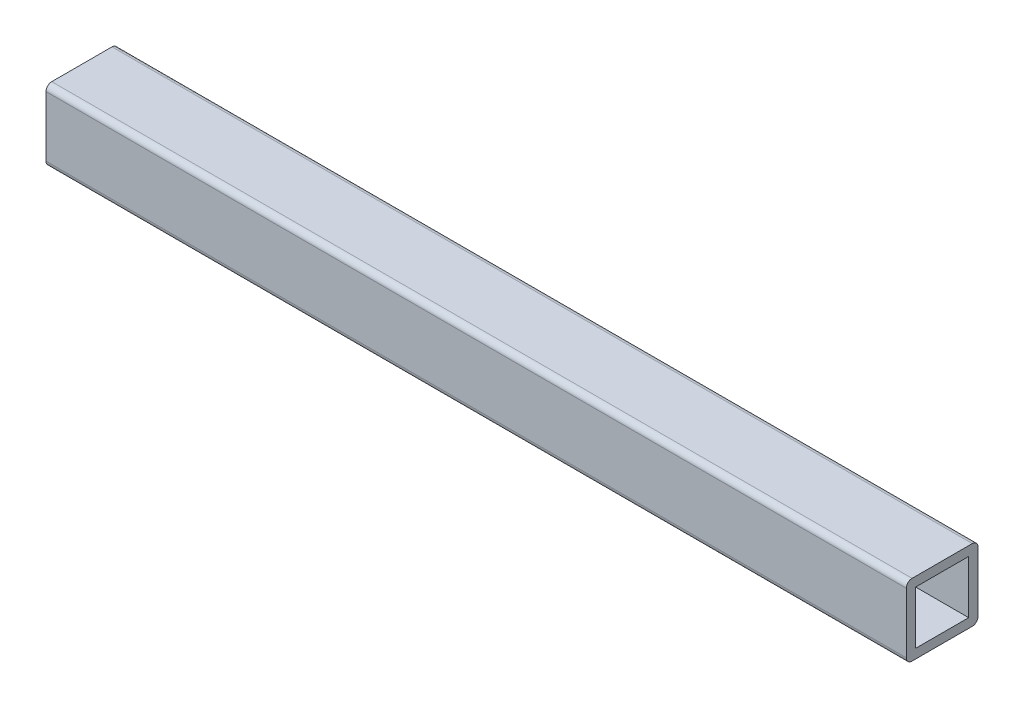
ISO-10303-21;
HEADER;
FILE_DESCRIPTION(('STEP AP214'),'2;1');
FILE_NAME('part.step','',(''),(''),'','','');
FILE_SCHEMA(('AUTOMOTIVE_DESIGN { 1 0 10303 214 1 1 1 1 }'));
ENDSEC;
DATA;
#1=APPLICATION_CONTEXT('core data for automotive mechanical design processes');
#2=APPLICATION_PROTOCOL_DEFINITION('international standard','automotive_design',2000,#1);
#3=PRODUCT_CONTEXT('',#1,'mechanical');
#4=PRODUCT('Part','Part','',(#3));
#5=PRODUCT_RELATED_PRODUCT_CATEGORY('part','',(#4));
#6=PRODUCT_DEFINITION_FORMATION('','',#4);
#7=PRODUCT_DEFINITION_CONTEXT('part definition',#1,'design');
#8=PRODUCT_DEFINITION('design','',#6,#7);
#9=PRODUCT_DEFINITION_SHAPE('','',#8);
#10=(LENGTH_UNIT() NAMED_UNIT(*) SI_UNIT(.MILLI.,.METRE.));
#11=(NAMED_UNIT(*) PLANE_ANGLE_UNIT() SI_UNIT($,.RADIAN.));
#12=(NAMED_UNIT(*) SI_UNIT($,.STERADIAN.) SOLID_ANGLE_UNIT());
#13=UNCERTAINTY_MEASURE_WITH_UNIT(LENGTH_MEASURE(1.E-05),#10,'distance_accuracy_value','');
#14=(GEOMETRIC_REPRESENTATION_CONTEXT(3) GLOBAL_UNCERTAINTY_ASSIGNED_CONTEXT((#13)) GLOBAL_UNIT_ASSIGNED_CONTEXT((#10,
#11,#12)) REPRESENTATION_CONTEXT('',''));
#15=CARTESIAN_POINT('',(0.,0.,0.));
#16=DIRECTION('',(0.,0.,1.));
#17=DIRECTION('',(1.,0.,0.));
#18=AXIS2_PLACEMENT_3D('',#15,#16,#17);
#19=CARTESIAN_POINT('',(152.4,10.541,21.209));
#20=DIRECTION('',(1.,0.,0.));
#21=DIRECTION('',(0.,0.,-1.));
#22=AXIS2_PLACEMENT_3D('',#19,#20,#21);
#23=PLANE('',#22);
#24=CARTESIAN_POINT('',(152.4,10.541,21.209));
#25=DIRECTION('',(1.,0.,0.));
#26=DIRECTION('',(0.,0.,-1.));
#27=AXIS2_PLACEMENT_3D('',#24,#25,#26);
#28=CIRCLE('',#27,1.01599999999999);
#29=CARTESIAN_POINT('',(152.4,10.541,22.225));
#30=VERTEX_POINT('',#29);
#31=CARTESIAN_POINT('',(152.4,9.525,21.209));
#32=VERTEX_POINT('',#31);
#33=EDGE_CURVE('E204',#30,#32,#28,.T.);
#34=ORIENTED_EDGE('',*,*,#33,.T.);
#35=DIRECTION('',(0.,0.,-1.));
#36=VECTOR('',#35,1.);
#37=CARTESIAN_POINT('',(152.4,9.525,21.209));
#38=LINE('',#37,#36);
#39=CARTESIAN_POINT('',(152.4,9.525,10.541));
#40=VERTEX_POINT('',#39);
#41=EDGE_CURVE('E248',#32,#40,#38,.T.);
#42=ORIENTED_EDGE('',*,*,#41,.T.);
#43=CARTESIAN_POINT('',(152.4,10.541,10.541));
#44=DIRECTION('',(1.,0.,0.));
#45=DIRECTION('',(0.,0.,-1.));
#46=AXIS2_PLACEMENT_3D('',#43,#44,#45);
#47=CIRCLE('',#46,1.016);
#48=CARTESIAN_POINT('',(152.4,10.541,9.525));
#49=VERTEX_POINT('',#48);
#50=EDGE_CURVE('E139',#40,#49,#47,.T.);
#51=ORIENTED_EDGE('',*,*,#50,.T.);
#52=DIRECTION('',(0.,1.,0.));
#53=VECTOR('',#52,1.);
#54=CARTESIAN_POINT('',(152.4,10.541,9.525));
#55=LINE('',#54,#53);
#56=CARTESIAN_POINT('',(152.4,21.209,9.525));
#57=VERTEX_POINT('',#56);
#58=EDGE_CURVE('E244',#49,#57,#55,.T.);
#59=ORIENTED_EDGE('',*,*,#58,.T.);
#60=CARTESIAN_POINT('',(152.4,21.209,10.541));
#61=DIRECTION('',(1.,0.,0.));
#62=DIRECTION('',(0.,0.,-1.));
#63=AXIS2_PLACEMENT_3D('',#60,#61,#62);
#64=CIRCLE('',#63,1.016);
#65=CARTESIAN_POINT('',(152.4,22.225,10.541));
#66=VERTEX_POINT('',#65);
#67=EDGE_CURVE('E241',#57,#66,#64,.T.);
#68=ORIENTED_EDGE('',*,*,#67,.T.);
#69=DIRECTION('',(0.,0.,1.));
#70=VECTOR('',#69,1.);
#71=CARTESIAN_POINT('',(152.4,22.225,10.541));
#72=LINE('',#71,#70);
#73=CARTESIAN_POINT('',(152.4,22.225,21.209));
#74=VERTEX_POINT('',#73);
#75=EDGE_CURVE('E220',#66,#74,#72,.T.);
#76=ORIENTED_EDGE('',*,*,#75,.T.);
#77=CARTESIAN_POINT('',(152.4,21.209,21.209));
#78=DIRECTION('',(1.,0.,0.));
#79=DIRECTION('',(0.,0.,-1.));
#80=AXIS2_PLACEMENT_3D('',#77,#78,#79);
#81=CIRCLE('',#80,1.016);
#82=CARTESIAN_POINT('',(152.4,21.209,22.225));
#83=VERTEX_POINT('',#82);
#84=EDGE_CURVE('E237',#74,#83,#81,.T.);
#85=ORIENTED_EDGE('',*,*,#84,.T.);
#86=DIRECTION('',(0.,-1.,0.));
#87=VECTOR('',#86,1.);
#88=CARTESIAN_POINT('',(152.4,21.209,22.225));
#89=LINE('',#88,#87);
#90=EDGE_CURVE('E201',#83,#30,#89,.T.);
#91=ORIENTED_EDGE('',*,*,#90,.T.);
#92=EDGE_LOOP('',(#34,#42,#51,#59,#68,#76,#85,#91));
#93=FACE_BOUND('',#92,.T.);
#94=DIRECTION('',(0.,1.,0.));
#95=VECTOR('',#94,1.);
#96=CARTESIAN_POINT('',(152.4,11.176,11.176));
#97=LINE('',#96,#95);
#98=CARTESIAN_POINT('',(152.4,11.176,11.176));
#99=VERTEX_POINT('',#98);
#100=CARTESIAN_POINT('',(152.4,20.574,11.176));
#101=VERTEX_POINT('',#100);
#102=EDGE_CURVE('E185',#99,#101,#97,.T.);
#103=ORIENTED_EDGE('',*,*,#102,.F.);
#104=DIRECTION('',(0.,0.,-1.));
#105=VECTOR('',#104,1.);
#106=CARTESIAN_POINT('',(152.4,11.176,20.574));
#107=LINE('',#106,#105);
#108=CARTESIAN_POINT('',(152.4,11.176,20.574));
#109=VERTEX_POINT('',#108);
#110=EDGE_CURVE('E90',#109,#99,#107,.T.);
#111=ORIENTED_EDGE('',*,*,#110,.F.);
#112=DIRECTION('',(0.,-1.,0.));
#113=VECTOR('',#112,1.);
#114=CARTESIAN_POINT('',(152.4,20.574,20.574));
#115=LINE('',#114,#113);
#116=CARTESIAN_POINT('',(152.4,20.574,20.574));
#117=VERTEX_POINT('',#116);
#118=EDGE_CURVE('E178',#117,#109,#115,.T.);
#119=ORIENTED_EDGE('',*,*,#118,.F.);
#120=DIRECTION('',(0.,0.,1.));
#121=VECTOR('',#120,1.);
#122=CARTESIAN_POINT('',(152.4,20.574,11.176));
#123=LINE('',#122,#121);
#124=EDGE_CURVE('E192',#101,#117,#123,.T.);
#125=ORIENTED_EDGE('',*,*,#124,.F.);
#126=EDGE_LOOP('',(#103,#111,#119,#125));
#127=FACE_BOUND('',#126,.T.);
#128=ADVANCED_FACE('F43',(#93,#127),#23,.T.);
#129=CARTESIAN_POINT('',(0.,10.541,21.209));
#130=DIRECTION('',(1.,0.,0.));
#131=DIRECTION('',(0.,0.,-1.));
#132=AXIS2_PLACEMENT_3D('',#129,#130,#131);
#133=PLANE('',#132);
#134=CARTESIAN_POINT('',(0.,10.541,21.209));
#135=DIRECTION('',(1.,0.,0.));
#136=DIRECTION('',(0.,0.,-1.));
#137=AXIS2_PLACEMENT_3D('',#134,#135,#136);
#138=CIRCLE('',#137,1.01599999999999);
#139=CARTESIAN_POINT('',(0.,10.541,22.225));
#140=VERTEX_POINT('',#139);
#141=CARTESIAN_POINT('',(0.,9.525,21.209));
#142=VERTEX_POINT('',#141);
#143=EDGE_CURVE('E132',#140,#142,#138,.T.);
#144=ORIENTED_EDGE('',*,*,#143,.F.);
#145=DIRECTION('',(0.,-1.,0.));
#146=VECTOR('',#145,1.);
#147=CARTESIAN_POINT('',(0.,21.209,22.225));
#148=LINE('',#147,#146);
#149=CARTESIAN_POINT('',(0.,21.209,22.225));
#150=VERTEX_POINT('',#149);
#151=EDGE_CURVE('E202',#150,#140,#148,.T.);
#152=ORIENTED_EDGE('',*,*,#151,.F.);
#153=CARTESIAN_POINT('',(0.,21.209,21.209));
#154=DIRECTION('',(1.,0.,0.));
#155=DIRECTION('',(0.,0.,-1.));
#156=AXIS2_PLACEMENT_3D('',#153,#154,#155);
#157=CIRCLE('',#156,1.016);
#158=CARTESIAN_POINT('',(0.,22.225,21.209));
#159=VERTEX_POINT('',#158);
#160=EDGE_CURVE('E205',#159,#150,#157,.T.);
#161=ORIENTED_EDGE('',*,*,#160,.F.);
#162=DIRECTION('',(0.,0.,1.));
#163=VECTOR('',#162,1.);
#164=CARTESIAN_POINT('',(0.,22.225,10.541));
#165=LINE('',#164,#163);
#166=CARTESIAN_POINT('',(0.,22.225,10.541));
#167=VERTEX_POINT('',#166);
#168=EDGE_CURVE('E207',#167,#159,#165,.T.);
#169=ORIENTED_EDGE('',*,*,#168,.F.);
#170=CARTESIAN_POINT('',(0.,21.209,10.541));
#171=DIRECTION('',(1.,0.,0.));
#172=DIRECTION('',(0.,0.,-1.));
#173=AXIS2_PLACEMENT_3D('',#170,#171,#172);
#174=CIRCLE('',#173,1.016);
#175=CARTESIAN_POINT('',(0.,21.209,9.525));
#176=VERTEX_POINT('',#175);
#177=EDGE_CURVE('E148',#176,#167,#174,.T.);
#178=ORIENTED_EDGE('',*,*,#177,.F.);
#179=DIRECTION('',(0.,1.,0.));
#180=VECTOR('',#179,1.);
#181=CARTESIAN_POINT('',(0.,10.541,9.525));
#182=LINE('',#181,#180);
#183=CARTESIAN_POINT('',(0.,10.541,9.525));
#184=VERTEX_POINT('',#183);
#185=EDGE_CURVE('E146',#184,#176,#182,.T.);
#186=ORIENTED_EDGE('',*,*,#185,.F.);
#187=CARTESIAN_POINT('',(0.,10.541,10.541));
#188=DIRECTION('',(1.,0.,0.));
#189=DIRECTION('',(0.,0.,-1.));
#190=AXIS2_PLACEMENT_3D('',#187,#188,#189);
#191=CIRCLE('',#190,1.016);
#192=CARTESIAN_POINT('',(0.,9.525,10.541));
#193=VERTEX_POINT('',#192);
#194=EDGE_CURVE('E131',#193,#184,#191,.T.);
#195=ORIENTED_EDGE('',*,*,#194,.F.);
#196=DIRECTION('',(0.,0.,-1.));
#197=VECTOR('',#196,1.);
#198=CARTESIAN_POINT('',(0.,9.525,21.209));
#199=LINE('',#198,#197);
#200=EDGE_CURVE('E121',#142,#193,#199,.T.);
#201=ORIENTED_EDGE('',*,*,#200,.F.);
#202=EDGE_LOOP('',(#144,#152,#161,#169,#178,#186,#195,#201));
#203=FACE_BOUND('',#202,.T.);
#204=DIRECTION('',(0.,0.,-1.));
#205=VECTOR('',#204,1.);
#206=CARTESIAN_POINT('',(0.,11.176,20.574));
#207=LINE('',#206,#205);
#208=CARTESIAN_POINT('',(0.,11.176,20.574));
#209=VERTEX_POINT('',#208);
#210=CARTESIAN_POINT('',(0.,11.176,11.176));
#211=VERTEX_POINT('',#210);
#212=EDGE_CURVE('E68',#209,#211,#207,.T.);
#213=ORIENTED_EDGE('',*,*,#212,.T.);
#214=DIRECTION('',(0.,1.,0.));
#215=VECTOR('',#214,1.);
#216=CARTESIAN_POINT('',(0.,11.176,11.176));
#217=LINE('',#216,#215);
#218=CARTESIAN_POINT('',(0.,20.574,11.176));
#219=VERTEX_POINT('',#218);
#220=EDGE_CURVE('E153',#211,#219,#217,.T.);
#221=ORIENTED_EDGE('',*,*,#220,.T.);
#222=DIRECTION('',(0.,0.,1.));
#223=VECTOR('',#222,1.);
#224=CARTESIAN_POINT('',(0.,20.574,11.176));
#225=LINE('',#224,#223);
#226=CARTESIAN_POINT('',(0.,20.574,20.574));
#227=VERTEX_POINT('',#226);
#228=EDGE_CURVE('E156',#219,#227,#225,.T.);
#229=ORIENTED_EDGE('',*,*,#228,.T.);
#230=DIRECTION('',(0.,-1.,0.));
#231=VECTOR('',#230,1.);
#232=CARTESIAN_POINT('',(0.,20.574,20.574));
#233=LINE('',#232,#231);
#234=EDGE_CURVE('E159',#227,#209,#233,.T.);
#235=ORIENTED_EDGE('',*,*,#234,.T.);
#236=EDGE_LOOP('',(#213,#221,#229,#235));
#237=FACE_BOUND('',#236,.T.);
#238=ADVANCED_FACE('F143',(#203,#237),#133,.F.);
#239=CARTESIAN_POINT('',(152.4,10.541,21.209));
#240=DIRECTION('',(-1.,0.,0.));
#241=DIRECTION('',(0.,-1.,0.));
#242=AXIS2_PLACEMENT_3D('',#239,#240,#241);
#243=CYLINDRICAL_SURFACE('',#242,1.016);
#244=ORIENTED_EDGE('',*,*,#143,.T.);
#245=DIRECTION('',(-1.,0.,0.));
#246=VECTOR('',#245,1.);
#247=CARTESIAN_POINT('',(152.4,9.525,21.209));
#248=LINE('',#247,#246);
#249=EDGE_CURVE('E11',#32,#142,#248,.T.);
#250=ORIENTED_EDGE('',*,*,#249,.F.);
#251=ORIENTED_EDGE('',*,*,#33,.F.);
#252=DIRECTION('',(-1.,0.,0.));
#253=VECTOR('',#252,1.);
#254=CARTESIAN_POINT('',(152.4,10.541,22.225));
#255=LINE('',#254,#253);
#256=EDGE_CURVE('E175',#30,#140,#255,.T.);
#257=ORIENTED_EDGE('',*,*,#256,.T.);
#258=EDGE_LOOP('',(#244,#250,#251,#257));
#259=FACE_BOUND('',#258,.T.);
#260=ADVANCED_FACE('F253',(#259),#243,.T.);
#261=CARTESIAN_POINT('',(152.4,9.525,21.209));
#262=DIRECTION('',(0.,1.,0.));
#263=DIRECTION('',(0.,0.,1.));
#264=AXIS2_PLACEMENT_3D('',#261,#262,#263);
#265=PLANE('',#264);
#266=ORIENTED_EDGE('',*,*,#200,.T.);
#267=DIRECTION('',(-1.,0.,0.));
#268=VECTOR('',#267,1.);
#269=CARTESIAN_POINT('',(152.4,9.525,10.541));
#270=LINE('',#269,#268);
#271=EDGE_CURVE('E52',#40,#193,#270,.T.);
#272=ORIENTED_EDGE('',*,*,#271,.F.);
#273=ORIENTED_EDGE('',*,*,#41,.F.);
#274=ORIENTED_EDGE('',*,*,#249,.T.);
#275=EDGE_LOOP('',(#266,#272,#273,#274));
#276=FACE_BOUND('',#275,.T.);
#277=ADVANCED_FACE('F125',(#276),#265,.F.);
#278=CARTESIAN_POINT('',(152.4,10.541,10.541));
#279=DIRECTION('',(-1.,0.,0.));
#280=DIRECTION('',(0.,-1.,0.));
#281=AXIS2_PLACEMENT_3D('',#278,#279,#280);
#282=CYLINDRICAL_SURFACE('',#281,1.016);
#283=ORIENTED_EDGE('',*,*,#194,.T.);
#284=DIRECTION('',(-1.,0.,0.));
#285=VECTOR('',#284,1.);
#286=CARTESIAN_POINT('',(152.4,10.541,9.525));
#287=LINE('',#286,#285);
#288=EDGE_CURVE('E140',#49,#184,#287,.T.);
#289=ORIENTED_EDGE('',*,*,#288,.F.);
#290=ORIENTED_EDGE('',*,*,#50,.F.);
#291=ORIENTED_EDGE('',*,*,#271,.T.);
#292=EDGE_LOOP('',(#283,#289,#290,#291));
#293=FACE_BOUND('',#292,.T.);
#294=ADVANCED_FACE('F135',(#293),#282,.T.);
#295=CARTESIAN_POINT('',(152.4,10.541,9.525));
#296=DIRECTION('',(0.,0.,1.));
#297=DIRECTION('',(1.,0.,0.));
#298=AXIS2_PLACEMENT_3D('',#295,#296,#297);
#299=PLANE('',#298);
#300=ORIENTED_EDGE('',*,*,#185,.T.);
#301=DIRECTION('',(-1.,0.,0.));
#302=VECTOR('',#301,1.);
#303=CARTESIAN_POINT('',(152.4,21.209,9.525));
#304=LINE('',#303,#302);
#305=EDGE_CURVE('E163',#57,#176,#304,.T.);
#306=ORIENTED_EDGE('',*,*,#305,.F.);
#307=ORIENTED_EDGE('',*,*,#58,.F.);
#308=ORIENTED_EDGE('',*,*,#288,.T.);
#309=EDGE_LOOP('',(#300,#306,#307,#308));
#310=FACE_BOUND('',#309,.T.);
#311=ADVANCED_FACE('F291',(#310),#299,.F.);
#312=CARTESIAN_POINT('',(152.4,21.209,10.541));
#313=DIRECTION('',(-1.,0.,0.));
#314=DIRECTION('',(0.,-1.,0.));
#315=AXIS2_PLACEMENT_3D('',#312,#313,#314);
#316=CYLINDRICAL_SURFACE('',#315,1.016);
#317=ORIENTED_EDGE('',*,*,#177,.T.);
#318=DIRECTION('',(-1.,0.,0.));
#319=VECTOR('',#318,1.);
#320=CARTESIAN_POINT('',(152.4,22.225,10.541));
#321=LINE('',#320,#319);
#322=EDGE_CURVE('E166',#66,#167,#321,.T.);
#323=ORIENTED_EDGE('',*,*,#322,.F.);
#324=ORIENTED_EDGE('',*,*,#67,.F.);
#325=ORIENTED_EDGE('',*,*,#305,.T.);
#326=EDGE_LOOP('',(#317,#323,#324,#325));
#327=FACE_BOUND('',#326,.T.);
#328=ADVANCED_FACE('F210',(#327),#316,.T.);
#329=CARTESIAN_POINT('',(152.4,22.225,10.541));
#330=DIRECTION('',(0.,-1.,0.));
#331=DIRECTION('',(0.,0.,-1.));
#332=AXIS2_PLACEMENT_3D('',#329,#330,#331);
#333=PLANE('',#332);
#334=ORIENTED_EDGE('',*,*,#168,.T.);
#335=DIRECTION('',(-1.,0.,0.));
#336=VECTOR('',#335,1.);
#337=CARTESIAN_POINT('',(152.4,22.225,21.209));
#338=LINE('',#337,#336);
#339=EDGE_CURVE('E169',#74,#159,#338,.T.);
#340=ORIENTED_EDGE('',*,*,#339,.F.);
#341=ORIENTED_EDGE('',*,*,#75,.F.);
#342=ORIENTED_EDGE('',*,*,#322,.T.);
#343=EDGE_LOOP('',(#334,#340,#341,#342));
#344=FACE_BOUND('',#343,.T.);
#345=ADVANCED_FACE('F217',(#344),#333,.F.);
#346=CARTESIAN_POINT('',(152.4,21.209,21.209));
#347=DIRECTION('',(-1.,0.,0.));
#348=DIRECTION('',(0.,-1.,0.));
#349=AXIS2_PLACEMENT_3D('',#346,#347,#348);
#350=CYLINDRICAL_SURFACE('',#349,1.016);
#351=ORIENTED_EDGE('',*,*,#160,.T.);
#352=DIRECTION('',(-1.,0.,0.));
#353=VECTOR('',#352,1.);
#354=CARTESIAN_POINT('',(152.4,21.209,22.225));
#355=LINE('',#354,#353);
#356=EDGE_CURVE('E172',#83,#150,#355,.T.);
#357=ORIENTED_EDGE('',*,*,#356,.F.);
#358=ORIENTED_EDGE('',*,*,#84,.F.);
#359=ORIENTED_EDGE('',*,*,#339,.T.);
#360=EDGE_LOOP('',(#351,#357,#358,#359));
#361=FACE_BOUND('',#360,.T.);
#362=ADVANCED_FACE('F225',(#361),#350,.T.);
#363=CARTESIAN_POINT('',(152.4,21.209,22.225));
#364=DIRECTION('',(0.,0.,-1.));
#365=DIRECTION('',(0.,1.,0.));
#366=AXIS2_PLACEMENT_3D('',#363,#364,#365);
#367=PLANE('',#366);
#368=ORIENTED_EDGE('',*,*,#151,.T.);
#369=ORIENTED_EDGE('',*,*,#256,.F.);
#370=ORIENTED_EDGE('',*,*,#90,.F.);
#371=ORIENTED_EDGE('',*,*,#356,.T.);
#372=EDGE_LOOP('',(#368,#369,#370,#371));
#373=FACE_BOUND('',#372,.T.);
#374=ADVANCED_FACE('F229',(#373),#367,.F.);
#375=CARTESIAN_POINT('',(152.4,11.176,20.574));
#376=DIRECTION('',(0.,1.,0.));
#377=DIRECTION('',(0.,0.,1.));
#378=AXIS2_PLACEMENT_3D('',#375,#376,#377);
#379=PLANE('',#378);
#380=ORIENTED_EDGE('',*,*,#212,.F.);
#381=DIRECTION('',(-1.,0.,0.));
#382=VECTOR('',#381,1.);
#383=CARTESIAN_POINT('',(152.4,11.176,20.574));
#384=LINE('',#383,#382);
#385=EDGE_CURVE('E176',#109,#209,#384,.T.);
#386=ORIENTED_EDGE('',*,*,#385,.F.);
#387=ORIENTED_EDGE('',*,*,#110,.T.);
#388=DIRECTION('',(-1.,0.,0.));
#389=VECTOR('',#388,1.);
#390=CARTESIAN_POINT('',(152.4,11.176,11.176));
#391=LINE('',#390,#389);
#392=EDGE_CURVE('E179',#99,#211,#391,.T.);
#393=ORIENTED_EDGE('',*,*,#392,.T.);
#394=EDGE_LOOP('',(#380,#386,#387,#393));
#395=FACE_BOUND('',#394,.T.);
#396=ADVANCED_FACE('F189',(#395),#379,.T.);
#397=CARTESIAN_POINT('',(152.4,11.176,11.176));
#398=DIRECTION('',(0.,0.,1.));
#399=DIRECTION('',(1.,0.,0.));
#400=AXIS2_PLACEMENT_3D('',#397,#398,#399);
#401=PLANE('',#400);
#402=ORIENTED_EDGE('',*,*,#220,.F.);
#403=ORIENTED_EDGE('',*,*,#392,.F.);
#404=ORIENTED_EDGE('',*,*,#102,.T.);
#405=DIRECTION('',(-1.,0.,0.));
#406=VECTOR('',#405,1.);
#407=CARTESIAN_POINT('',(152.4,20.574,11.176));
#408=LINE('',#407,#406);
#409=EDGE_CURVE('E180',#101,#219,#408,.T.);
#410=ORIENTED_EDGE('',*,*,#409,.T.);
#411=EDGE_LOOP('',(#402,#403,#404,#410));
#412=FACE_BOUND('',#411,.T.);
#413=ADVANCED_FACE('F183',(#412),#401,.T.);
#414=CARTESIAN_POINT('',(152.4,20.574,11.176));
#415=DIRECTION('',(0.,-1.,0.));
#416=DIRECTION('',(0.,0.,-1.));
#417=AXIS2_PLACEMENT_3D('',#414,#415,#416);
#418=PLANE('',#417);
#419=ORIENTED_EDGE('',*,*,#228,.F.);
#420=ORIENTED_EDGE('',*,*,#409,.F.);
#421=ORIENTED_EDGE('',*,*,#124,.T.);
#422=DIRECTION('',(-1.,0.,0.));
#423=VECTOR('',#422,1.);
#424=CARTESIAN_POINT('',(152.4,20.574,20.574));
#425=LINE('',#424,#423);
#426=EDGE_CURVE('E47',#117,#227,#425,.T.);
#427=ORIENTED_EDGE('',*,*,#426,.T.);
#428=EDGE_LOOP('',(#419,#420,#421,#427));
#429=FACE_BOUND('',#428,.T.);
#430=ADVANCED_FACE('F187',(#429),#418,.T.);
#431=CARTESIAN_POINT('',(152.4,20.574,20.574));
#432=DIRECTION('',(0.,0.,-1.));
#433=DIRECTION('',(0.,1.,0.));
#434=AXIS2_PLACEMENT_3D('',#431,#432,#433);
#435=PLANE('',#434);
#436=ORIENTED_EDGE('',*,*,#234,.F.);
#437=ORIENTED_EDGE('',*,*,#426,.F.);
#438=ORIENTED_EDGE('',*,*,#118,.T.);
#439=ORIENTED_EDGE('',*,*,#385,.T.);
#440=EDGE_LOOP('',(#436,#437,#438,#439));
#441=FACE_BOUND('',#440,.T.);
#442=ADVANCED_FACE('F45',(#441),#435,.T.);
#443=CLOSED_SHELL('',(#128,#238,#260,#277,#294,#311,#328,#345,#362,#374,#396,#413,#430,#442));
#444=MANIFOLD_SOLID_BREP('B2',#443);
#445=ADVANCED_BREP_SHAPE_REPRESENTATION('',(#18,#444),#14);
#446=SHAPE_DEFINITION_REPRESENTATION(#9,#445);
ENDSEC;
END-ISO-10303-21;
